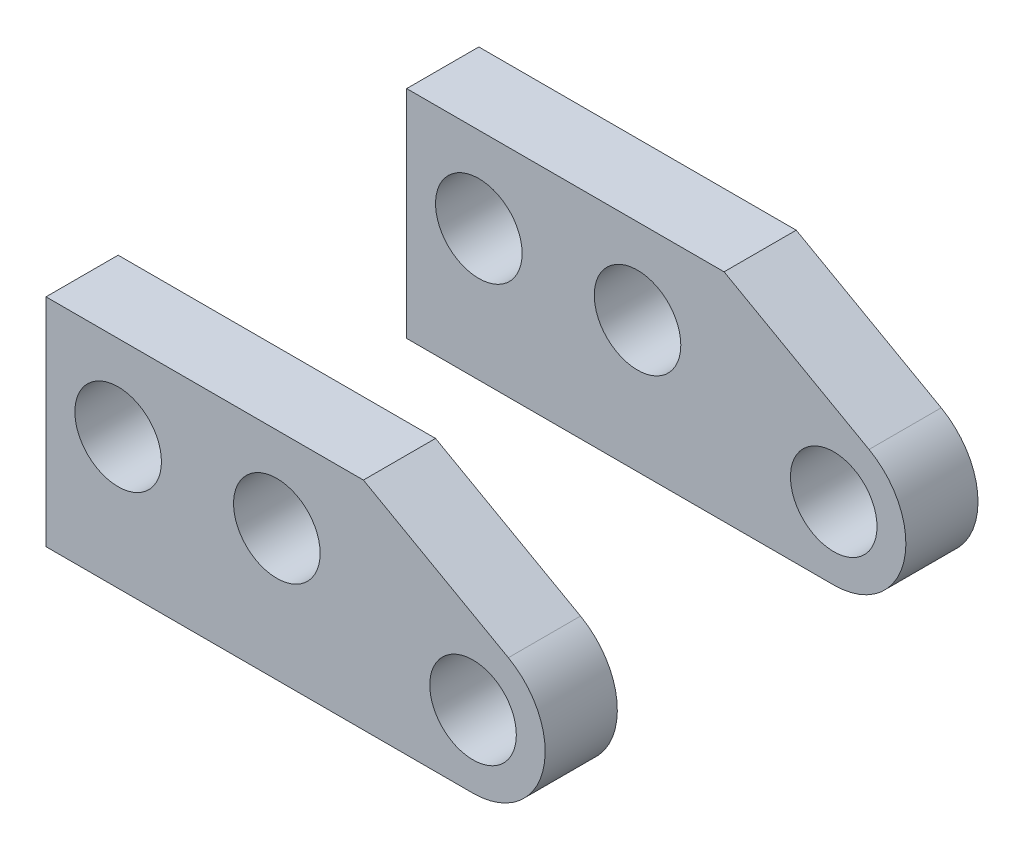
ISO-10303-21;
HEADER;
FILE_DESCRIPTION(('STEP AP214'),'2;1');
FILE_NAME('part.step','',(''),(''),'','','');
FILE_SCHEMA(('AUTOMOTIVE_DESIGN { 1 0 10303 214 1 1 1 1 }'));
ENDSEC;
DATA;
#1=APPLICATION_CONTEXT('core data for automotive mechanical design processes');
#2=APPLICATION_PROTOCOL_DEFINITION('international standard','automotive_design',2000,#1);
#3=PRODUCT_CONTEXT('',#1,'mechanical');
#4=PRODUCT('Part','Part','',(#3));
#5=PRODUCT_RELATED_PRODUCT_CATEGORY('part','',(#4));
#6=PRODUCT_DEFINITION_FORMATION('','',#4);
#7=PRODUCT_DEFINITION_CONTEXT('part definition',#1,'design');
#8=PRODUCT_DEFINITION('design','',#6,#7);
#9=PRODUCT_DEFINITION_SHAPE('','',#8);
#10=(LENGTH_UNIT() NAMED_UNIT(*) SI_UNIT(.MILLI.,.METRE.));
#11=(NAMED_UNIT(*) PLANE_ANGLE_UNIT() SI_UNIT($,.RADIAN.));
#12=(NAMED_UNIT(*) SI_UNIT($,.STERADIAN.) SOLID_ANGLE_UNIT());
#13=UNCERTAINTY_MEASURE_WITH_UNIT(LENGTH_MEASURE(1.E-05),#10,'distance_accuracy_value','');
#14=(GEOMETRIC_REPRESENTATION_CONTEXT(3) GLOBAL_UNCERTAINTY_ASSIGNED_CONTEXT((#13)) GLOBAL_UNIT_ASSIGNED_CONTEXT((#10,
#11,#12)) REPRESENTATION_CONTEXT('',''));
#15=CARTESIAN_POINT('',(0.,0.,0.));
#16=DIRECTION('',(0.,0.,1.));
#17=DIRECTION('',(1.,0.,0.));
#18=AXIS2_PLACEMENT_3D('',#15,#16,#17);
#19=CARTESIAN_POINT('',(9.3,-1.25,15.));
#20=DIRECTION('',(0.,0.,1.));
#21=DIRECTION('',(1.,0.,0.));
#22=AXIS2_PLACEMENT_3D('',#19,#20,#21);
#23=PLANE('',#22);
#24=CARTESIAN_POINT('',(2.5,0.8,15.));
#25=DIRECTION('',(0.,0.,1.));
#26=DIRECTION('',(1.,0.,0.));
#27=AXIS2_PLACEMENT_3D('',#24,#25,#26);
#28=CIRCLE('',#27,1.5);
#29=CARTESIAN_POINT('',(4.,0.8,15.));
#30=VERTEX_POINT('',#29);
#31=EDGE_CURVE('E185',#30,#30,#28,.T.);
#32=ORIENTED_EDGE('',*,*,#31,.F.);
#33=EDGE_LOOP('',(#32));
#34=FACE_BOUND('',#33,.T.);
#35=DIRECTION('',(0.,-1.,0.));
#36=VECTOR('',#35,1.);
#37=CARTESIAN_POINT('',(-5.5,3.75,15.));
#38=LINE('',#37,#36);
#39=CARTESIAN_POINT('',(-5.5,3.75,15.));
#40=VERTEX_POINT('',#39);
#41=CARTESIAN_POINT('',(-5.5,-3.75,15.));
#42=VERTEX_POINT('',#41);
#43=EDGE_CURVE('E135',#40,#42,#38,.T.);
#44=ORIENTED_EDGE('',*,*,#43,.T.);
#45=DIRECTION('',(1.,0.,0.));
#46=VECTOR('',#45,1.);
#47=CARTESIAN_POINT('',(-5.5,-3.75,15.));
#48=LINE('',#47,#46);
#49=CARTESIAN_POINT('',(9.3,-3.75,15.));
#50=VERTEX_POINT('',#49);
#51=EDGE_CURVE('E102',#42,#50,#48,.T.);
#52=ORIENTED_EDGE('',*,*,#51,.T.);
#53=CARTESIAN_POINT('',(9.3,-1.25,15.));
#54=DIRECTION('',(0.,0.,1.));
#55=DIRECTION('',(1.,0.,0.));
#56=AXIS2_PLACEMENT_3D('',#53,#54,#55);
#57=CIRCLE('',#56,2.5);
#58=CARTESIAN_POINT('',(10.5237183976717,0.930025982230464,15.));
#59=VERTEX_POINT('',#58);
#60=EDGE_CURVE('E106',#50,#59,#57,.T.);
#61=ORIENTED_EDGE('',*,*,#60,.T.);
#62=DIRECTION('',(-0.872010392892185,0.489487359068665,0.));
#63=VECTOR('',#62,1.);
#64=CARTESIAN_POINT('',(10.5237183976717,0.930025982230464,15.));
#65=LINE('',#64,#63);
#66=CARTESIAN_POINT('',(5.5,3.75,15.));
#67=VERTEX_POINT('',#66);
#68=EDGE_CURVE('E110',#59,#67,#65,.T.);
#69=ORIENTED_EDGE('',*,*,#68,.T.);
#70=DIRECTION('',(-1.,0.,0.));
#71=VECTOR('',#70,1.);
#72=CARTESIAN_POINT('',(5.5,3.75,15.));
#73=LINE('',#72,#71);
#74=EDGE_CURVE('E68',#67,#40,#73,.T.);
#75=ORIENTED_EDGE('',*,*,#74,.T.);
#76=EDGE_LOOP('',(#44,#52,#61,#69,#75));
#77=FACE_BOUND('',#76,.T.);
#78=CARTESIAN_POINT('',(9.3,-1.25,15.));
#79=DIRECTION('',(0.,0.,1.));
#80=DIRECTION('',(1.,0.,0.));
#81=AXIS2_PLACEMENT_3D('',#78,#79,#80);
#82=CIRCLE('',#81,1.5);
#83=CARTESIAN_POINT('',(10.8,-1.25,15.));
#84=VERTEX_POINT('',#83);
#85=EDGE_CURVE('E130',#84,#84,#82,.T.);
#86=ORIENTED_EDGE('',*,*,#85,.F.);
#87=EDGE_LOOP('',(#86));
#88=FACE_BOUND('',#87,.T.);
#89=CARTESIAN_POINT('',(-3.,0.8,15.));
#90=DIRECTION('',(0.,0.,1.));
#91=DIRECTION('',(1.,0.,0.));
#92=AXIS2_PLACEMENT_3D('',#89,#90,#91);
#93=CIRCLE('',#92,1.5);
#94=CARTESIAN_POINT('',(-1.5,0.8,15.));
#95=VERTEX_POINT('',#94);
#96=EDGE_CURVE('E176',#95,#95,#93,.T.);
#97=ORIENTED_EDGE('',*,*,#96,.F.);
#98=EDGE_LOOP('',(#97));
#99=FACE_BOUND('',#98,.T.);
#100=ADVANCED_FACE('F51',(#34,#77,#88,#99),#23,.T.);
#101=CARTESIAN_POINT('',(9.3,-1.25,12.5));
#102=DIRECTION('',(0.,0.,1.));
#103=DIRECTION('',(1.,0.,0.));
#104=AXIS2_PLACEMENT_3D('',#101,#102,#103);
#105=PLANE('',#104);
#106=DIRECTION('',(0.,-1.,0.));
#107=VECTOR('',#106,1.);
#108=CARTESIAN_POINT('',(-5.5,3.75,12.5));
#109=LINE('',#108,#107);
#110=CARTESIAN_POINT('',(-5.5,3.75,12.5));
#111=VERTEX_POINT('',#110);
#112=CARTESIAN_POINT('',(-5.5,-3.75,12.5));
#113=VERTEX_POINT('',#112);
#114=EDGE_CURVE('E126',#111,#113,#109,.T.);
#115=ORIENTED_EDGE('',*,*,#114,.F.);
#116=DIRECTION('',(-1.,0.,0.));
#117=VECTOR('',#116,1.);
#118=CARTESIAN_POINT('',(5.5,3.75,12.5));
#119=LINE('',#118,#117);
#120=CARTESIAN_POINT('',(5.5,3.75,12.5));
#121=VERTEX_POINT('',#120);
#122=EDGE_CURVE('E94',#121,#111,#119,.T.);
#123=ORIENTED_EDGE('',*,*,#122,.F.);
#124=DIRECTION('',(-0.872010392892185,0.489487359068665,0.));
#125=VECTOR('',#124,1.);
#126=CARTESIAN_POINT('',(10.5237183976717,0.930025982230464,12.5));
#127=LINE('',#126,#125);
#128=CARTESIAN_POINT('',(10.5237183976717,0.930025982230464,12.5));
#129=VERTEX_POINT('',#128);
#130=EDGE_CURVE('E88',#129,#121,#127,.T.);
#131=ORIENTED_EDGE('',*,*,#130,.F.);
#132=CARTESIAN_POINT('',(9.3,-1.25,12.5));
#133=DIRECTION('',(0.,0.,1.));
#134=DIRECTION('',(1.,0.,0.));
#135=AXIS2_PLACEMENT_3D('',#132,#133,#134);
#136=CIRCLE('',#135,2.5);
#137=CARTESIAN_POINT('',(9.3,-3.75,12.5));
#138=VERTEX_POINT('',#137);
#139=EDGE_CURVE('E117',#138,#129,#136,.T.);
#140=ORIENTED_EDGE('',*,*,#139,.F.);
#141=DIRECTION('',(1.,0.,0.));
#142=VECTOR('',#141,1.);
#143=CARTESIAN_POINT('',(-5.5,-3.75,12.5));
#144=LINE('',#143,#142);
#145=EDGE_CURVE('E129',#113,#138,#144,.T.);
#146=ORIENTED_EDGE('',*,*,#145,.F.);
#147=EDGE_LOOP('',(#115,#123,#131,#140,#146));
#148=FACE_BOUND('',#147,.T.);
#149=CARTESIAN_POINT('',(9.3,-1.25,12.5));
#150=DIRECTION('',(0.,0.,1.));
#151=DIRECTION('',(1.,0.,0.));
#152=AXIS2_PLACEMENT_3D('',#149,#150,#151);
#153=CIRCLE('',#152,1.5);
#154=CARTESIAN_POINT('',(10.8,-1.25,12.5));
#155=VERTEX_POINT('',#154);
#156=EDGE_CURVE('E188',#155,#155,#153,.T.);
#157=ORIENTED_EDGE('',*,*,#156,.T.);
#158=EDGE_LOOP('',(#157));
#159=FACE_BOUND('',#158,.T.);
#160=CARTESIAN_POINT('',(2.5,0.8,12.5));
#161=DIRECTION('',(0.,0.,1.));
#162=DIRECTION('',(1.,0.,0.));
#163=AXIS2_PLACEMENT_3D('',#160,#161,#162);
#164=CIRCLE('',#163,1.5);
#165=CARTESIAN_POINT('',(4.,0.8,12.5));
#166=VERTEX_POINT('',#165);
#167=EDGE_CURVE('E182',#166,#166,#164,.T.);
#168=ORIENTED_EDGE('',*,*,#167,.T.);
#169=EDGE_LOOP('',(#168));
#170=FACE_BOUND('',#169,.T.);
#171=CARTESIAN_POINT('',(-3.,0.8,12.5));
#172=DIRECTION('',(0.,0.,1.));
#173=DIRECTION('',(1.,0.,0.));
#174=AXIS2_PLACEMENT_3D('',#171,#172,#173);
#175=CIRCLE('',#174,1.5);
#176=CARTESIAN_POINT('',(-1.5,0.8,12.5));
#177=VERTEX_POINT('',#176);
#178=EDGE_CURVE('E179',#177,#177,#175,.T.);
#179=ORIENTED_EDGE('',*,*,#178,.T.);
#180=EDGE_LOOP('',(#179));
#181=FACE_BOUND('',#180,.T.);
#182=ADVANCED_FACE('F139',(#148,#159,#170,#181),#105,.F.);
#183=CARTESIAN_POINT('',(-5.5,3.75,15.));
#184=DIRECTION('',(1.,0.,0.));
#185=DIRECTION('',(0.,0.,-1.));
#186=AXIS2_PLACEMENT_3D('',#183,#184,#185);
#187=PLANE('',#186);
#188=ORIENTED_EDGE('',*,*,#114,.T.);
#189=DIRECTION('',(0.,0.,-1.));
#190=VECTOR('',#189,1.);
#191=CARTESIAN_POINT('',(-5.5,-3.75,15.));
#192=LINE('',#191,#190);
#193=EDGE_CURVE('E12',#42,#113,#192,.T.);
#194=ORIENTED_EDGE('',*,*,#193,.F.);
#195=ORIENTED_EDGE('',*,*,#43,.F.);
#196=DIRECTION('',(0.,0.,-1.));
#197=VECTOR('',#196,1.);
#198=CARTESIAN_POINT('',(-5.5,3.75,15.));
#199=LINE('',#198,#197);
#200=EDGE_CURVE('E122',#40,#111,#199,.T.);
#201=ORIENTED_EDGE('',*,*,#200,.T.);
#202=EDGE_LOOP('',(#188,#194,#195,#201));
#203=FACE_BOUND('',#202,.T.);
#204=ADVANCED_FACE('F53',(#203),#187,.F.);
#205=CARTESIAN_POINT('',(-5.5,-3.75,15.));
#206=DIRECTION('',(0.,1.,0.));
#207=DIRECTION('',(-1.,0.,0.));
#208=AXIS2_PLACEMENT_3D('',#205,#206,#207);
#209=PLANE('',#208);
#210=ORIENTED_EDGE('',*,*,#145,.T.);
#211=DIRECTION('',(0.,0.,-1.));
#212=VECTOR('',#211,1.);
#213=CARTESIAN_POINT('',(9.3,-3.75,15.));
#214=LINE('',#213,#212);
#215=EDGE_CURVE('E60',#50,#138,#214,.T.);
#216=ORIENTED_EDGE('',*,*,#215,.F.);
#217=ORIENTED_EDGE('',*,*,#51,.F.);
#218=ORIENTED_EDGE('',*,*,#193,.T.);
#219=EDGE_LOOP('',(#210,#216,#217,#218));
#220=FACE_BOUND('',#219,.T.);
#221=ADVANCED_FACE('F232',(#220),#209,.F.);
#222=CARTESIAN_POINT('',(9.3,-1.25,15.));
#223=DIRECTION('',(0.,0.,-1.));
#224=DIRECTION('',(-1.,0.,0.));
#225=AXIS2_PLACEMENT_3D('',#222,#223,#224);
#226=CYLINDRICAL_SURFACE('',#225,2.5);
#227=ORIENTED_EDGE('',*,*,#139,.T.);
#228=DIRECTION('',(0.,0.,-1.));
#229=VECTOR('',#228,1.);
#230=CARTESIAN_POINT('',(10.5237183976717,0.930025982230464,15.));
#231=LINE('',#230,#229);
#232=EDGE_CURVE('E114',#59,#129,#231,.T.);
#233=ORIENTED_EDGE('',*,*,#232,.F.);
#234=ORIENTED_EDGE('',*,*,#60,.F.);
#235=ORIENTED_EDGE('',*,*,#215,.T.);
#236=EDGE_LOOP('',(#227,#233,#234,#235));
#237=FACE_BOUND('',#236,.T.);
#238=ADVANCED_FACE('F115',(#237),#226,.T.);
#239=CARTESIAN_POINT('',(10.5237183976717,0.930025982230464,15.));
#240=DIRECTION('',(-0.489487359068665,-0.872010392892185,0.));
#241=DIRECTION('',(0.872010392892185,-0.489487359068665,0.));
#242=AXIS2_PLACEMENT_3D('',#239,#240,#241);
#243=PLANE('',#242);
#244=ORIENTED_EDGE('',*,*,#130,.T.);
#245=DIRECTION('',(0.,0.,-1.));
#246=VECTOR('',#245,1.);
#247=CARTESIAN_POINT('',(5.5,3.75,15.));
#248=LINE('',#247,#246);
#249=EDGE_CURVE('E118',#67,#121,#248,.T.);
#250=ORIENTED_EDGE('',*,*,#249,.F.);
#251=ORIENTED_EDGE('',*,*,#68,.F.);
#252=ORIENTED_EDGE('',*,*,#232,.T.);
#253=EDGE_LOOP('',(#244,#250,#251,#252));
#254=FACE_BOUND('',#253,.T.);
#255=ADVANCED_FACE('F120',(#254),#243,.F.);
#256=CARTESIAN_POINT('',(5.5,3.75,15.));
#257=DIRECTION('',(0.,-1.,0.));
#258=DIRECTION('',(0.,0.,-1.));
#259=AXIS2_PLACEMENT_3D('',#256,#257,#258);
#260=PLANE('',#259);
#261=ORIENTED_EDGE('',*,*,#122,.T.);
#262=ORIENTED_EDGE('',*,*,#200,.F.);
#263=ORIENTED_EDGE('',*,*,#74,.F.);
#264=ORIENTED_EDGE('',*,*,#249,.T.);
#265=EDGE_LOOP('',(#261,#262,#263,#264));
#266=FACE_BOUND('',#265,.T.);
#267=ADVANCED_FACE('F144',(#266),#260,.F.);
#268=CARTESIAN_POINT('',(9.3,-1.25,15.));
#269=DIRECTION('',(0.,0.,-1.));
#270=DIRECTION('',(-1.,0.,0.));
#271=AXIS2_PLACEMENT_3D('',#268,#269,#270);
#272=CYLINDRICAL_SURFACE('',#271,1.5);
#273=ORIENTED_EDGE('',*,*,#85,.T.);
#274=EDGE_LOOP('',(#273));
#275=FACE_BOUND('',#274,.T.);
#276=ORIENTED_EDGE('',*,*,#156,.F.);
#277=EDGE_LOOP('',(#276));
#278=FACE_BOUND('',#277,.T.);
#279=ADVANCED_FACE('F146',(#275,#278),#272,.F.);
#280=CARTESIAN_POINT('',(2.5,0.8,15.));
#281=DIRECTION('',(0.,0.,-1.));
#282=DIRECTION('',(-1.,0.,0.));
#283=AXIS2_PLACEMENT_3D('',#280,#281,#282);
#284=CYLINDRICAL_SURFACE('',#283,1.5);
#285=ORIENTED_EDGE('',*,*,#31,.T.);
#286=EDGE_LOOP('',(#285));
#287=FACE_BOUND('',#286,.T.);
#288=ORIENTED_EDGE('',*,*,#167,.F.);
#289=EDGE_LOOP('',(#288));
#290=FACE_BOUND('',#289,.T.);
#291=ADVANCED_FACE('F152',(#287,#290),#284,.F.);
#292=CARTESIAN_POINT('',(-3.,0.8,15.));
#293=DIRECTION('',(0.,0.,-1.));
#294=DIRECTION('',(-1.,0.,0.));
#295=AXIS2_PLACEMENT_3D('',#292,#293,#294);
#296=CYLINDRICAL_SURFACE('',#295,1.5);
#297=ORIENTED_EDGE('',*,*,#96,.T.);
#298=EDGE_LOOP('',(#297));
#299=FACE_BOUND('',#298,.T.);
#300=ORIENTED_EDGE('',*,*,#178,.F.);
#301=EDGE_LOOP('',(#300));
#302=FACE_BOUND('',#301,.T.);
#303=ADVANCED_FACE('F167',(#299,#302),#296,.F.);
#304=CLOSED_SHELL('',(#100,#182,#204,#221,#238,#255,#267,#279,#291,#303));
#305=MANIFOLD_SOLID_BREP('B2',#304);
#306=CARTESIAN_POINT('',(9.3,-1.25,2.5));
#307=DIRECTION('',(0.,0.,1.));
#308=DIRECTION('',(1.,0.,0.));
#309=AXIS2_PLACEMENT_3D('',#306,#307,#308);
#310=PLANE('',#309);
#311=CARTESIAN_POINT('',(-3.,0.8,2.5));
#312=DIRECTION('',(0.,0.,1.));
#313=DIRECTION('',(1.,0.,0.));
#314=AXIS2_PLACEMENT_3D('',#311,#312,#313);
#315=CIRCLE('',#314,1.5);
#316=CARTESIAN_POINT('',(-1.5,0.8,2.5));
#317=VERTEX_POINT('',#316);
#318=EDGE_CURVE('E384',#317,#317,#315,.T.);
#319=ORIENTED_EDGE('',*,*,#318,.F.);
#320=EDGE_LOOP('',(#319));
#321=FACE_BOUND('',#320,.T.);
#322=DIRECTION('',(1.,0.,0.));
#323=VECTOR('',#322,1.);
#324=CARTESIAN_POINT('',(5.5,-3.75,2.5));
#325=LINE('',#324,#323);
#326=CARTESIAN_POINT('',(-5.5,-3.75,2.5));
#327=VERTEX_POINT('',#326);
#328=CARTESIAN_POINT('',(9.3,-3.75,2.5));
#329=VERTEX_POINT('',#328);
#330=EDGE_CURVE('E301',#327,#329,#325,.T.);
#331=ORIENTED_EDGE('',*,*,#330,.T.);
#332=CARTESIAN_POINT('',(9.3,-1.25,2.5));
#333=DIRECTION('',(0.,0.,1.));
#334=DIRECTION('',(1.,0.,0.));
#335=AXIS2_PLACEMENT_3D('',#332,#333,#334);
#336=CIRCLE('',#335,2.5);
#337=CARTESIAN_POINT('',(10.5237183976717,0.930025982230464,2.5));
#338=VERTEX_POINT('',#337);
#339=EDGE_CURVE('E336',#329,#338,#336,.T.);
#340=ORIENTED_EDGE('',*,*,#339,.T.);
#341=DIRECTION('',(-0.872010392892185,0.489487359068665,0.));
#342=VECTOR('',#341,1.);
#343=CARTESIAN_POINT('',(5.5,3.75,2.5));
#344=LINE('',#343,#342);
#345=CARTESIAN_POINT('',(5.5,3.75,2.5));
#346=VERTEX_POINT('',#345);
#347=EDGE_CURVE('E341',#338,#346,#344,.T.);
#348=ORIENTED_EDGE('',*,*,#347,.T.);
#349=DIRECTION('',(-1.,0.,0.));
#350=VECTOR('',#349,1.);
#351=CARTESIAN_POINT('',(-5.5,3.75,2.5));
#352=LINE('',#351,#350);
#353=CARTESIAN_POINT('',(-5.5,3.75,2.5));
#354=VERTEX_POINT('',#353);
#355=EDGE_CURVE('E345',#346,#354,#352,.T.);
#356=ORIENTED_EDGE('',*,*,#355,.T.);
#357=DIRECTION('',(0.,-1.,0.));
#358=VECTOR('',#357,1.);
#359=CARTESIAN_POINT('',(-5.5,3.75,2.5));
#360=LINE('',#359,#358);
#361=EDGE_CURVE('E357',#354,#327,#360,.T.);
#362=ORIENTED_EDGE('',*,*,#361,.T.);
#363=EDGE_LOOP('',(#331,#340,#348,#356,#362));
#364=FACE_BOUND('',#363,.T.);
#365=CARTESIAN_POINT('',(9.3,-1.25,2.5));
#366=DIRECTION('',(0.,0.,1.));
#367=DIRECTION('',(1.,0.,0.));
#368=AXIS2_PLACEMENT_3D('',#365,#366,#367);
#369=CIRCLE('',#368,1.5);
#370=CARTESIAN_POINT('',(10.8,-1.25,2.5));
#371=VERTEX_POINT('',#370);
#372=EDGE_CURVE('E365',#371,#371,#369,.T.);
#373=ORIENTED_EDGE('',*,*,#372,.F.);
#374=EDGE_LOOP('',(#373));
#375=FACE_BOUND('',#374,.T.);
#376=CARTESIAN_POINT('',(2.5,0.8,2.5));
#377=DIRECTION('',(0.,0.,1.));
#378=DIRECTION('',(1.,0.,0.));
#379=AXIS2_PLACEMENT_3D('',#376,#377,#378);
#380=CIRCLE('',#379,1.5);
#381=CARTESIAN_POINT('',(4.,0.8,2.5));
#382=VERTEX_POINT('',#381);
#383=EDGE_CURVE('E390',#382,#382,#380,.T.);
#384=ORIENTED_EDGE('',*,*,#383,.F.);
#385=EDGE_LOOP('',(#384));
#386=FACE_BOUND('',#385,.T.);
#387=ADVANCED_FACE('F284',(#321,#364,#375,#386),#310,.T.);
#388=CARTESIAN_POINT('',(9.3,-1.25,0.));
#389=DIRECTION('',(0.,0.,1.));
#390=DIRECTION('',(1.,0.,0.));
#391=AXIS2_PLACEMENT_3D('',#388,#389,#390);
#392=PLANE('',#391);
#393=CARTESIAN_POINT('',(9.3,-1.25,0.));
#394=DIRECTION('',(0.,0.,1.));
#395=DIRECTION('',(1.,0.,0.));
#396=AXIS2_PLACEMENT_3D('',#393,#394,#395);
#397=CIRCLE('',#396,2.5);
#398=CARTESIAN_POINT('',(9.3,-3.75,0.));
#399=VERTEX_POINT('',#398);
#400=CARTESIAN_POINT('',(10.5237183976717,0.930025982230464,0.));
#401=VERTEX_POINT('',#400);
#402=EDGE_CURVE('E363',#399,#401,#397,.T.);
#403=ORIENTED_EDGE('',*,*,#402,.F.);
#404=DIRECTION('',(1.,0.,0.));
#405=VECTOR('',#404,1.);
#406=CARTESIAN_POINT('',(-5.5,-3.75,0.));
#407=LINE('',#406,#405);
#408=CARTESIAN_POINT('',(-5.5,-3.75,0.));
#409=VERTEX_POINT('',#408);
#410=EDGE_CURVE('E369',#409,#399,#407,.T.);
#411=ORIENTED_EDGE('',*,*,#410,.F.);
#412=DIRECTION('',(0.,-1.,0.));
#413=VECTOR('',#412,1.);
#414=CARTESIAN_POINT('',(-5.5,3.75,0.));
#415=LINE('',#414,#413);
#416=CARTESIAN_POINT('',(-5.5,3.75,0.));
#417=VERTEX_POINT('',#416);
#418=EDGE_CURVE('E329',#417,#409,#415,.T.);
#419=ORIENTED_EDGE('',*,*,#418,.F.);
#420=DIRECTION('',(-1.,0.,0.));
#421=VECTOR('',#420,1.);
#422=CARTESIAN_POINT('',(-5.5,3.75,0.));
#423=LINE('',#422,#421);
#424=CARTESIAN_POINT('',(5.5,3.75,0.));
#425=VERTEX_POINT('',#424);
#426=EDGE_CURVE('E322',#425,#417,#423,.T.);
#427=ORIENTED_EDGE('',*,*,#426,.F.);
#428=DIRECTION('',(-0.872010392892185,0.489487359068665,0.));
#429=VECTOR('',#428,1.);
#430=CARTESIAN_POINT('',(5.5,3.75,0.));
#431=LINE('',#430,#429);
#432=EDGE_CURVE('E352',#401,#425,#431,.T.);
#433=ORIENTED_EDGE('',*,*,#432,.F.);
#434=EDGE_LOOP('',(#403,#411,#419,#427,#433));
#435=FACE_BOUND('',#434,.T.);
#436=CARTESIAN_POINT('',(9.3,-1.25,0.));
#437=DIRECTION('',(0.,0.,1.));
#438=DIRECTION('',(1.,0.,0.));
#439=AXIS2_PLACEMENT_3D('',#436,#437,#438);
#440=CIRCLE('',#439,1.5);
#441=CARTESIAN_POINT('',(10.8,-1.25,0.));
#442=VERTEX_POINT('',#441);
#443=EDGE_CURVE('E381',#442,#442,#440,.T.);
#444=ORIENTED_EDGE('',*,*,#443,.T.);
#445=EDGE_LOOP('',(#444));
#446=FACE_BOUND('',#445,.T.);
#447=CARTESIAN_POINT('',(-3.,0.8,0.));
#448=DIRECTION('',(0.,0.,1.));
#449=DIRECTION('',(1.,0.,0.));
#450=AXIS2_PLACEMENT_3D('',#447,#448,#449);
#451=CIRCLE('',#450,1.5);
#452=CARTESIAN_POINT('',(-1.5,0.8,0.));
#453=VERTEX_POINT('',#452);
#454=EDGE_CURVE('E387',#453,#453,#451,.T.);
#455=ORIENTED_EDGE('',*,*,#454,.T.);
#456=EDGE_LOOP('',(#455));
#457=FACE_BOUND('',#456,.T.);
#458=CARTESIAN_POINT('',(2.5,0.8,0.));
#459=DIRECTION('',(0.,0.,1.));
#460=DIRECTION('',(1.,0.,0.));
#461=AXIS2_PLACEMENT_3D('',#458,#459,#460);
#462=CIRCLE('',#461,1.5);
#463=CARTESIAN_POINT('',(4.,0.8,0.));
#464=VERTEX_POINT('',#463);
#465=EDGE_CURVE('E393',#464,#464,#462,.T.);
#466=ORIENTED_EDGE('',*,*,#465,.T.);
#467=EDGE_LOOP('',(#466));
#468=FACE_BOUND('',#467,.T.);
#469=ADVANCED_FACE('F374',(#435,#446,#457,#468),#392,.F.);
#470=CARTESIAN_POINT('',(9.3,-1.25,2.5));
#471=DIRECTION('',(0.,0.,-1.));
#472=DIRECTION('',(-1.,0.,0.));
#473=AXIS2_PLACEMENT_3D('',#470,#471,#472);
#474=CYLINDRICAL_SURFACE('',#473,2.5);
#475=ORIENTED_EDGE('',*,*,#402,.T.);
#476=DIRECTION('',(0.,0.,-1.));
#477=VECTOR('',#476,1.);
#478=CARTESIAN_POINT('',(10.5237183976717,0.930025982230464,2.5));
#479=LINE('',#478,#477);
#480=EDGE_CURVE('E293',#338,#401,#479,.T.);
#481=ORIENTED_EDGE('',*,*,#480,.F.);
#482=ORIENTED_EDGE('',*,*,#339,.F.);
#483=DIRECTION('',(0.,0.,-1.));
#484=VECTOR('',#483,1.);
#485=CARTESIAN_POINT('',(9.3,-3.75,2.5));
#486=LINE('',#485,#484);
#487=EDGE_CURVE('E49',#329,#399,#486,.T.);
#488=ORIENTED_EDGE('',*,*,#487,.T.);
#489=EDGE_LOOP('',(#475,#481,#482,#488));
#490=FACE_BOUND('',#489,.T.);
#491=ADVANCED_FACE('F286',(#490),#474,.T.);
#492=CARTESIAN_POINT('',(5.5,3.75,2.5));
#493=DIRECTION('',(-0.489487359068665,-0.872010392892185,0.));
#494=DIRECTION('',(0.872010392892185,-0.489487359068665,0.));
#495=AXIS2_PLACEMENT_3D('',#492,#493,#494);
#496=PLANE('',#495);
#497=ORIENTED_EDGE('',*,*,#432,.T.);
#498=DIRECTION('',(0.,0.,-1.));
#499=VECTOR('',#498,1.);
#500=CARTESIAN_POINT('',(5.5,3.75,2.5));
#501=LINE('',#500,#499);
#502=EDGE_CURVE('E349',#346,#425,#501,.T.);
#503=ORIENTED_EDGE('',*,*,#502,.F.);
#504=ORIENTED_EDGE('',*,*,#347,.F.);
#505=ORIENTED_EDGE('',*,*,#480,.T.);
#506=EDGE_LOOP('',(#497,#503,#504,#505));
#507=FACE_BOUND('',#506,.T.);
#508=ADVANCED_FACE('F350',(#507),#496,.F.);
#509=CARTESIAN_POINT('',(-5.5,3.75,2.5));
#510=DIRECTION('',(0.,-1.,0.));
#511=DIRECTION('',(0.,0.,-1.));
#512=AXIS2_PLACEMENT_3D('',#509,#510,#511);
#513=PLANE('',#512);
#514=ORIENTED_EDGE('',*,*,#426,.T.);
#515=DIRECTION('',(0.,0.,-1.));
#516=VECTOR('',#515,1.);
#517=CARTESIAN_POINT('',(-5.5,3.75,2.5));
#518=LINE('',#517,#516);
#519=EDGE_CURVE('E353',#354,#417,#518,.T.);
#520=ORIENTED_EDGE('',*,*,#519,.F.);
#521=ORIENTED_EDGE('',*,*,#355,.F.);
#522=ORIENTED_EDGE('',*,*,#502,.T.);
#523=EDGE_LOOP('',(#514,#520,#521,#522));
#524=FACE_BOUND('',#523,.T.);
#525=ADVANCED_FACE('F355',(#524),#513,.F.);
#526=CARTESIAN_POINT('',(-5.5,3.75,2.5));
#527=DIRECTION('',(1.,0.,0.));
#528=DIRECTION('',(0.,0.,-1.));
#529=AXIS2_PLACEMENT_3D('',#526,#527,#528);
#530=PLANE('',#529);
#531=ORIENTED_EDGE('',*,*,#418,.T.);
#532=DIRECTION('',(0.,0.,-1.));
#533=VECTOR('',#532,1.);
#534=CARTESIAN_POINT('',(-5.5,-3.75,2.5));
#535=LINE('',#534,#533);
#536=EDGE_CURVE('E359',#327,#409,#535,.T.);
#537=ORIENTED_EDGE('',*,*,#536,.F.);
#538=ORIENTED_EDGE('',*,*,#361,.F.);
#539=ORIENTED_EDGE('',*,*,#519,.T.);
#540=EDGE_LOOP('',(#531,#537,#538,#539));
#541=FACE_BOUND('',#540,.T.);
#542=ADVANCED_FACE('F378',(#541),#530,.F.);
#543=CARTESIAN_POINT('',(-5.5,-3.75,2.5));
#544=DIRECTION('',(0.,1.,0.));
#545=DIRECTION('',(0.,0.,1.));
#546=AXIS2_PLACEMENT_3D('',#543,#544,#545);
#547=PLANE('',#546);
#548=ORIENTED_EDGE('',*,*,#410,.T.);
#549=ORIENTED_EDGE('',*,*,#487,.F.);
#550=ORIENTED_EDGE('',*,*,#330,.F.);
#551=ORIENTED_EDGE('',*,*,#536,.T.);
#552=EDGE_LOOP('',(#548,#549,#550,#551));
#553=FACE_BOUND('',#552,.T.);
#554=ADVANCED_FACE('F377',(#553),#547,.F.);
#555=CARTESIAN_POINT('',(9.3,-1.25,2.5));
#556=DIRECTION('',(0.,0.,-1.));
#557=DIRECTION('',(-1.,0.,0.));
#558=AXIS2_PLACEMENT_3D('',#555,#556,#557);
#559=CYLINDRICAL_SURFACE('',#558,1.5);
#560=ORIENTED_EDGE('',*,*,#372,.T.);
#561=EDGE_LOOP('',(#560));
#562=FACE_BOUND('',#561,.T.);
#563=ORIENTED_EDGE('',*,*,#443,.F.);
#564=EDGE_LOOP('',(#563));
#565=FACE_BOUND('',#564,.T.);
#566=ADVANCED_FACE('F411',(#562,#565),#559,.F.);
#567=CARTESIAN_POINT('',(-3.,0.8,2.5));
#568=DIRECTION('',(0.,0.,-1.));
#569=DIRECTION('',(-1.,0.,0.));
#570=AXIS2_PLACEMENT_3D('',#567,#568,#569);
#571=CYLINDRICAL_SURFACE('',#570,1.5);
#572=ORIENTED_EDGE('',*,*,#318,.T.);
#573=EDGE_LOOP('',(#572));
#574=FACE_BOUND('',#573,.T.);
#575=ORIENTED_EDGE('',*,*,#454,.F.);
#576=EDGE_LOOP('',(#575));
#577=FACE_BOUND('',#576,.T.);
#578=ADVANCED_FACE('F473',(#574,#577),#571,.F.);
#579=CARTESIAN_POINT('',(2.5,0.8,2.5));
#580=DIRECTION('',(0.,0.,-1.));
#581=DIRECTION('',(-1.,0.,0.));
#582=AXIS2_PLACEMENT_3D('',#579,#580,#581);
#583=CYLINDRICAL_SURFACE('',#582,1.5);
#584=ORIENTED_EDGE('',*,*,#383,.T.);
#585=EDGE_LOOP('',(#584));
#586=FACE_BOUND('',#585,.T.);
#587=ORIENTED_EDGE('',*,*,#465,.F.);
#588=EDGE_LOOP('',(#587));
#589=FACE_BOUND('',#588,.T.);
#590=ADVANCED_FACE('F399',(#586,#589),#583,.F.);
#591=CLOSED_SHELL('',(#387,#469,#491,#508,#525,#542,#554,#566,#578,#590));
#592=MANIFOLD_SOLID_BREP('B6',#591);
#593=ADVANCED_BREP_SHAPE_REPRESENTATION('',(#18,#305,#592),#14);
#594=SHAPE_DEFINITION_REPRESENTATION(#9,#593);
ENDSEC;
END-ISO-10303-21;
